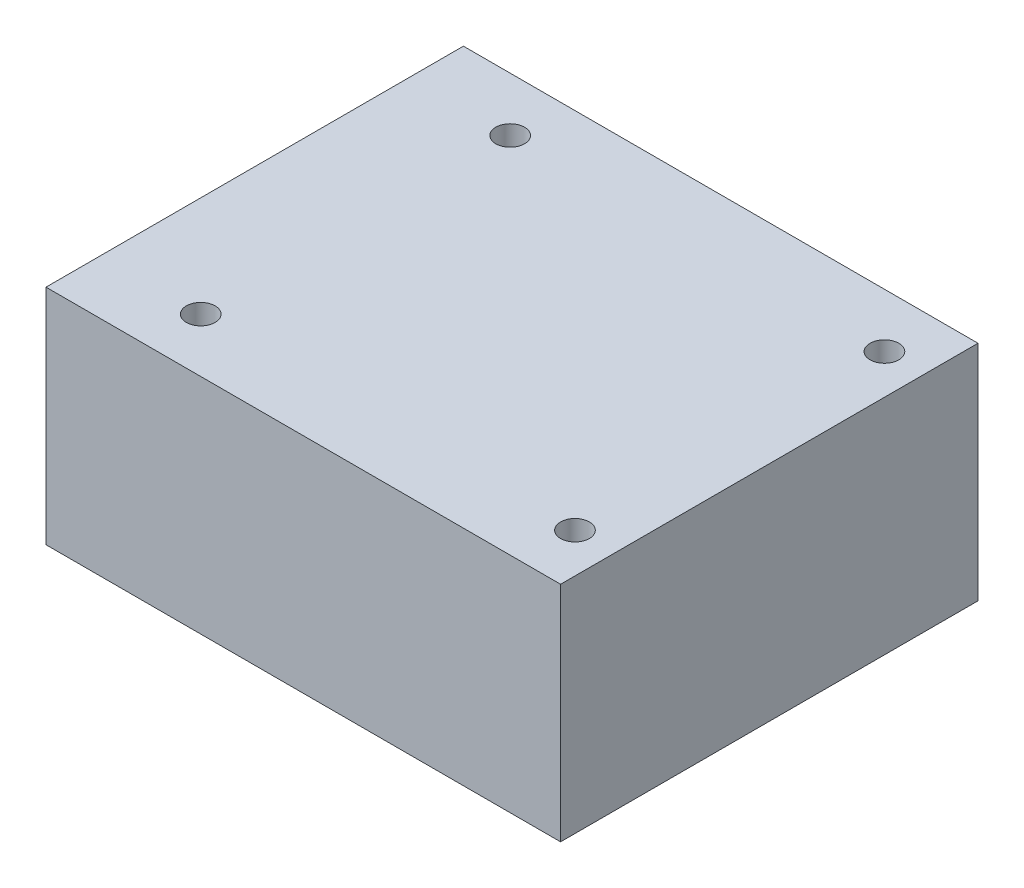
ISO-10303-21;
HEADER;
FILE_DESCRIPTION(('STEP AP214'),'2;1');
FILE_NAME('part.step','',(''),(''),'','','');
FILE_SCHEMA(('AUTOMOTIVE_DESIGN { 1 0 10303 214 1 1 1 1 }'));
ENDSEC;
DATA;
#1=APPLICATION_CONTEXT('core data for automotive mechanical design processes');
#2=APPLICATION_PROTOCOL_DEFINITION('international standard','automotive_design',2000,#1);
#3=PRODUCT_CONTEXT('',#1,'mechanical');
#4=PRODUCT('Part','Part','',(#3));
#5=PRODUCT_RELATED_PRODUCT_CATEGORY('part','',(#4));
#6=PRODUCT_DEFINITION_FORMATION('','',#4);
#7=PRODUCT_DEFINITION_CONTEXT('part definition',#1,'design');
#8=PRODUCT_DEFINITION('design','',#6,#7);
#9=PRODUCT_DEFINITION_SHAPE('','',#8);
#10=(LENGTH_UNIT() NAMED_UNIT(*) SI_UNIT(.MILLI.,.METRE.));
#11=(NAMED_UNIT(*) PLANE_ANGLE_UNIT() SI_UNIT($,.RADIAN.));
#12=(NAMED_UNIT(*) SI_UNIT($,.STERADIAN.) SOLID_ANGLE_UNIT());
#13=UNCERTAINTY_MEASURE_WITH_UNIT(LENGTH_MEASURE(1.E-05),#10,'distance_accuracy_value','');
#14=(GEOMETRIC_REPRESENTATION_CONTEXT(3) GLOBAL_UNCERTAINTY_ASSIGNED_CONTEXT((#13)) GLOBAL_UNIT_ASSIGNED_CONTEXT((#10,
#11,#12)) REPRESENTATION_CONTEXT('',''));
#15=CARTESIAN_POINT('',(0.,0.,0.));
#16=DIRECTION('',(0.,0.,1.));
#17=DIRECTION('',(1.,0.,0.));
#18=AXIS2_PLACEMENT_3D('',#15,#16,#17);
#19=CARTESIAN_POINT('',(35.75,31.,29.));
#20=DIRECTION('',(0.,1.,0.));
#21=DIRECTION('',(0.,0.,1.));
#22=AXIS2_PLACEMENT_3D('',#19,#20,#21);
#23=PLANE('',#22);
#24=CARTESIAN_POINT('',(30.25,31.,21.5));
#25=DIRECTION('',(0.,1.,0.));
#26=DIRECTION('',(0.,0.,1.));
#27=AXIS2_PLACEMENT_3D('',#24,#25,#26);
#28=CIRCLE('',#27,2.);
#29=CARTESIAN_POINT('',(30.25,31.,23.5));
#30=VERTEX_POINT('',#29);
#31=EDGE_CURVE('E119',#30,#30,#28,.T.);
#32=ORIENTED_EDGE('',*,*,#31,.F.);
#33=EDGE_LOOP('',(#32));
#34=FACE_BOUND('',#33,.T.);
#35=CARTESIAN_POINT('',(-21.75,31.,-21.5));
#36=DIRECTION('',(0.,1.,0.));
#37=DIRECTION('',(0.,0.,1.));
#38=AXIS2_PLACEMENT_3D('',#35,#36,#37);
#39=CIRCLE('',#38,2.);
#40=CARTESIAN_POINT('',(-21.75,31.,-19.5));
#41=VERTEX_POINT('',#40);
#42=EDGE_CURVE('E98',#41,#41,#39,.T.);
#43=ORIENTED_EDGE('',*,*,#42,.F.);
#44=EDGE_LOOP('',(#43));
#45=FACE_BOUND('',#44,.T.);
#46=DIRECTION('',(0.,0.,-1.));
#47=VECTOR('',#46,1.);
#48=CARTESIAN_POINT('',(35.75,31.,-29.));
#49=LINE('',#48,#47);
#50=CARTESIAN_POINT('',(35.75,31.,29.));
#51=VERTEX_POINT('',#50);
#52=CARTESIAN_POINT('',(35.75,31.,-29.));
#53=VERTEX_POINT('',#52);
#54=EDGE_CURVE('E83',#51,#53,#49,.T.);
#55=ORIENTED_EDGE('',*,*,#54,.T.);
#56=DIRECTION('',(-1.,0.,0.));
#57=VECTOR('',#56,1.);
#58=CARTESIAN_POINT('',(-35.75,31.,-29.));
#59=LINE('',#58,#57);
#60=CARTESIAN_POINT('',(-35.75,31.,-29.));
#61=VERTEX_POINT('',#60);
#62=EDGE_CURVE('E78',#53,#61,#59,.T.);
#63=ORIENTED_EDGE('',*,*,#62,.T.);
#64=DIRECTION('',(0.,0.,1.));
#65=VECTOR('',#64,1.);
#66=CARTESIAN_POINT('',(-35.75,31.,-29.));
#67=LINE('',#66,#65);
#68=CARTESIAN_POINT('',(-35.75,31.,29.));
#69=VERTEX_POINT('',#68);
#70=EDGE_CURVE('E81',#61,#69,#67,.T.);
#71=ORIENTED_EDGE('',*,*,#70,.T.);
#72=DIRECTION('',(1.,0.,0.));
#73=VECTOR('',#72,1.);
#74=CARTESIAN_POINT('',(-35.75,31.,29.));
#75=LINE('',#74,#73);
#76=EDGE_CURVE('E48',#69,#51,#75,.T.);
#77=ORIENTED_EDGE('',*,*,#76,.T.);
#78=EDGE_LOOP('',(#55,#63,#71,#77));
#79=FACE_BOUND('',#78,.T.);
#80=CARTESIAN_POINT('',(30.25,31.,-21.5));
#81=DIRECTION('',(0.,1.,0.));
#82=DIRECTION('',(0.,0.,1.));
#83=AXIS2_PLACEMENT_3D('',#80,#81,#82);
#84=CIRCLE('',#83,2.);
#85=CARTESIAN_POINT('',(30.25,31.,-19.5));
#86=VERTEX_POINT('',#85);
#87=EDGE_CURVE('E113',#86,#86,#84,.T.);
#88=ORIENTED_EDGE('',*,*,#87,.F.);
#89=EDGE_LOOP('',(#88));
#90=FACE_BOUND('',#89,.T.);
#91=CARTESIAN_POINT('',(-21.75,31.,21.5));
#92=DIRECTION('',(0.,1.,0.));
#93=DIRECTION('',(0.,0.,1.));
#94=AXIS2_PLACEMENT_3D('',#91,#92,#93);
#95=CIRCLE('',#94,2.);
#96=CARTESIAN_POINT('',(-21.75,31.,23.5));
#97=VERTEX_POINT('',#96);
#98=EDGE_CURVE('E125',#97,#97,#95,.T.);
#99=ORIENTED_EDGE('',*,*,#98,.F.);
#100=EDGE_LOOP('',(#99));
#101=FACE_BOUND('',#100,.T.);
#102=ADVANCED_FACE('F31',(#34,#45,#79,#90,#101),#23,.T.);
#103=CARTESIAN_POINT('',(35.75,0.,29.));
#104=DIRECTION('',(0.,1.,0.));
#105=DIRECTION('',(0.,0.,1.));
#106=AXIS2_PLACEMENT_3D('',#103,#104,#105);
#107=PLANE('',#106);
#108=CARTESIAN_POINT('',(30.25,0.,21.5));
#109=DIRECTION('',(0.,1.,0.));
#110=DIRECTION('',(0.,0.,1.));
#111=AXIS2_PLACEMENT_3D('',#108,#109,#110);
#112=CIRCLE('',#111,2.);
#113=CARTESIAN_POINT('',(30.25,0.,23.5));
#114=VERTEX_POINT('',#113);
#115=EDGE_CURVE('E122',#114,#114,#112,.T.);
#116=ORIENTED_EDGE('',*,*,#115,.T.);
#117=EDGE_LOOP('',(#116));
#118=FACE_BOUND('',#117,.T.);
#119=CARTESIAN_POINT('',(-21.75,0.,-21.5));
#120=DIRECTION('',(0.,1.,0.));
#121=DIRECTION('',(0.,0.,1.));
#122=AXIS2_PLACEMENT_3D('',#119,#120,#121);
#123=CIRCLE('',#122,2.);
#124=CARTESIAN_POINT('',(-21.75,0.,-19.5));
#125=VERTEX_POINT('',#124);
#126=EDGE_CURVE('E110',#125,#125,#123,.T.);
#127=ORIENTED_EDGE('',*,*,#126,.T.);
#128=EDGE_LOOP('',(#127));
#129=FACE_BOUND('',#128,.T.);
#130=DIRECTION('',(0.,0.,-1.));
#131=VECTOR('',#130,1.);
#132=CARTESIAN_POINT('',(35.75,0.,-29.));
#133=LINE('',#132,#131);
#134=CARTESIAN_POINT('',(35.75,0.,29.));
#135=VERTEX_POINT('',#134);
#136=CARTESIAN_POINT('',(35.75,0.,-29.));
#137=VERTEX_POINT('',#136);
#138=EDGE_CURVE('E95',#135,#137,#133,.T.);
#139=ORIENTED_EDGE('',*,*,#138,.F.);
#140=DIRECTION('',(1.,0.,0.));
#141=VECTOR('',#140,1.);
#142=CARTESIAN_POINT('',(-35.75,0.,29.));
#143=LINE('',#142,#141);
#144=CARTESIAN_POINT('',(-35.75,0.,29.));
#145=VERTEX_POINT('',#144);
#146=EDGE_CURVE('E71',#145,#135,#143,.T.);
#147=ORIENTED_EDGE('',*,*,#146,.F.);
#148=DIRECTION('',(0.,0.,1.));
#149=VECTOR('',#148,1.);
#150=CARTESIAN_POINT('',(-35.75,0.,-29.));
#151=LINE('',#150,#149);
#152=CARTESIAN_POINT('',(-35.75,0.,-29.));
#153=VERTEX_POINT('',#152);
#154=EDGE_CURVE('E65',#153,#145,#151,.T.);
#155=ORIENTED_EDGE('',*,*,#154,.F.);
#156=DIRECTION('',(-1.,0.,0.));
#157=VECTOR('',#156,1.);
#158=CARTESIAN_POINT('',(-35.75,0.,-29.));
#159=LINE('',#158,#157);
#160=EDGE_CURVE('E87',#137,#153,#159,.T.);
#161=ORIENTED_EDGE('',*,*,#160,.F.);
#162=EDGE_LOOP('',(#139,#147,#155,#161));
#163=FACE_BOUND('',#162,.T.);
#164=CARTESIAN_POINT('',(30.25,0.,-21.5));
#165=DIRECTION('',(0.,1.,0.));
#166=DIRECTION('',(0.,0.,1.));
#167=AXIS2_PLACEMENT_3D('',#164,#165,#166);
#168=CIRCLE('',#167,2.);
#169=CARTESIAN_POINT('',(30.25,0.,-19.5));
#170=VERTEX_POINT('',#169);
#171=EDGE_CURVE('E116',#170,#170,#168,.T.);
#172=ORIENTED_EDGE('',*,*,#171,.T.);
#173=EDGE_LOOP('',(#172));
#174=FACE_BOUND('',#173,.T.);
#175=CARTESIAN_POINT('',(-21.75,0.,21.5));
#176=DIRECTION('',(0.,1.,0.));
#177=DIRECTION('',(0.,0.,1.));
#178=AXIS2_PLACEMENT_3D('',#175,#176,#177);
#179=CIRCLE('',#178,2.);
#180=CARTESIAN_POINT('',(-21.75,0.,23.5));
#181=VERTEX_POINT('',#180);
#182=EDGE_CURVE('E128',#181,#181,#179,.T.);
#183=ORIENTED_EDGE('',*,*,#182,.T.);
#184=EDGE_LOOP('',(#183));
#185=FACE_BOUND('',#184,.T.);
#186=ADVANCED_FACE('F106',(#118,#129,#163,#174,#185),#107,.F.);
#187=CARTESIAN_POINT('',(35.75,31.,-29.));
#188=DIRECTION('',(-1.,0.,0.));
#189=DIRECTION('',(0.,0.,1.));
#190=AXIS2_PLACEMENT_3D('',#187,#188,#189);
#191=PLANE('',#190);
#192=ORIENTED_EDGE('',*,*,#138,.T.);
#193=DIRECTION('',(0.,-1.,0.));
#194=VECTOR('',#193,1.);
#195=CARTESIAN_POINT('',(35.75,31.,-29.));
#196=LINE('',#195,#194);
#197=EDGE_CURVE('E11',#53,#137,#196,.T.);
#198=ORIENTED_EDGE('',*,*,#197,.F.);
#199=ORIENTED_EDGE('',*,*,#54,.F.);
#200=DIRECTION('',(0.,-1.,0.));
#201=VECTOR('',#200,1.);
#202=CARTESIAN_POINT('',(35.75,31.,29.));
#203=LINE('',#202,#201);
#204=EDGE_CURVE('E91',#51,#135,#203,.T.);
#205=ORIENTED_EDGE('',*,*,#204,.T.);
#206=EDGE_LOOP('',(#192,#198,#199,#205));
#207=FACE_BOUND('',#206,.T.);
#208=ADVANCED_FACE('F33',(#207),#191,.F.);
#209=CARTESIAN_POINT('',(-35.75,31.,-29.));
#210=DIRECTION('',(0.,0.,1.));
#211=DIRECTION('',(1.,0.,0.));
#212=AXIS2_PLACEMENT_3D('',#209,#210,#211);
#213=PLANE('',#212);
#214=ORIENTED_EDGE('',*,*,#160,.T.);
#215=DIRECTION('',(0.,-1.,0.));
#216=VECTOR('',#215,1.);
#217=CARTESIAN_POINT('',(-35.75,31.,-29.));
#218=LINE('',#217,#216);
#219=EDGE_CURVE('E40',#61,#153,#218,.T.);
#220=ORIENTED_EDGE('',*,*,#219,.F.);
#221=ORIENTED_EDGE('',*,*,#62,.F.);
#222=ORIENTED_EDGE('',*,*,#197,.T.);
#223=EDGE_LOOP('',(#214,#220,#221,#222));
#224=FACE_BOUND('',#223,.T.);
#225=ADVANCED_FACE('F86',(#224),#213,.F.);
#226=CARTESIAN_POINT('',(-35.75,31.,-29.));
#227=DIRECTION('',(1.,0.,0.));
#228=DIRECTION('',(0.,0.,-1.));
#229=AXIS2_PLACEMENT_3D('',#226,#227,#228);
#230=PLANE('',#229);
#231=ORIENTED_EDGE('',*,*,#154,.T.);
#232=DIRECTION('',(0.,-1.,0.));
#233=VECTOR('',#232,1.);
#234=CARTESIAN_POINT('',(-35.75,31.,29.));
#235=LINE('',#234,#233);
#236=EDGE_CURVE('E88',#69,#145,#235,.T.);
#237=ORIENTED_EDGE('',*,*,#236,.F.);
#238=ORIENTED_EDGE('',*,*,#70,.F.);
#239=ORIENTED_EDGE('',*,*,#219,.T.);
#240=EDGE_LOOP('',(#231,#237,#238,#239));
#241=FACE_BOUND('',#240,.T.);
#242=ADVANCED_FACE('F89',(#241),#230,.F.);
#243=CARTESIAN_POINT('',(-35.75,31.,29.));
#244=DIRECTION('',(0.,0.,-1.));
#245=DIRECTION('',(-1.,0.,0.));
#246=AXIS2_PLACEMENT_3D('',#243,#244,#245);
#247=PLANE('',#246);
#248=ORIENTED_EDGE('',*,*,#146,.T.);
#249=ORIENTED_EDGE('',*,*,#204,.F.);
#250=ORIENTED_EDGE('',*,*,#76,.F.);
#251=ORIENTED_EDGE('',*,*,#236,.T.);
#252=EDGE_LOOP('',(#248,#249,#250,#251));
#253=FACE_BOUND('',#252,.T.);
#254=ADVANCED_FACE('F103',(#253),#247,.F.);
#255=CARTESIAN_POINT('',(-21.75,31.,-21.5));
#256=DIRECTION('',(0.,-1.,0.));
#257=DIRECTION('',(0.,0.,-1.));
#258=AXIS2_PLACEMENT_3D('',#255,#256,#257);
#259=CYLINDRICAL_SURFACE('',#258,2.);
#260=ORIENTED_EDGE('',*,*,#42,.T.);
#261=EDGE_LOOP('',(#260));
#262=FACE_BOUND('',#261,.T.);
#263=ORIENTED_EDGE('',*,*,#126,.F.);
#264=EDGE_LOOP('',(#263));
#265=FACE_BOUND('',#264,.T.);
#266=ADVANCED_FACE('F148',(#262,#265),#259,.F.);
#267=CARTESIAN_POINT('',(30.25,31.,-21.5));
#268=DIRECTION('',(0.,-1.,0.));
#269=DIRECTION('',(0.,0.,-1.));
#270=AXIS2_PLACEMENT_3D('',#267,#268,#269);
#271=CYLINDRICAL_SURFACE('',#270,2.);
#272=ORIENTED_EDGE('',*,*,#87,.T.);
#273=EDGE_LOOP('',(#272));
#274=FACE_BOUND('',#273,.T.);
#275=ORIENTED_EDGE('',*,*,#171,.F.);
#276=EDGE_LOOP('',(#275));
#277=FACE_BOUND('',#276,.T.);
#278=ADVANCED_FACE('F194',(#274,#277),#271,.F.);
#279=CARTESIAN_POINT('',(30.25,31.,21.5));
#280=DIRECTION('',(0.,-1.,0.));
#281=DIRECTION('',(0.,0.,-1.));
#282=AXIS2_PLACEMENT_3D('',#279,#280,#281);
#283=CYLINDRICAL_SURFACE('',#282,2.);
#284=ORIENTED_EDGE('',*,*,#31,.T.);
#285=EDGE_LOOP('',(#284));
#286=FACE_BOUND('',#285,.T.);
#287=ORIENTED_EDGE('',*,*,#115,.F.);
#288=EDGE_LOOP('',(#287));
#289=FACE_BOUND('',#288,.T.);
#290=ADVANCED_FACE('F202',(#286,#289),#283,.F.);
#291=CARTESIAN_POINT('',(-21.75,31.,21.5));
#292=DIRECTION('',(0.,-1.,0.));
#293=DIRECTION('',(0.,0.,-1.));
#294=AXIS2_PLACEMENT_3D('',#291,#292,#293);
#295=CYLINDRICAL_SURFACE('',#294,2.);
#296=ORIENTED_EDGE('',*,*,#98,.T.);
#297=EDGE_LOOP('',(#296));
#298=FACE_BOUND('',#297,.T.);
#299=ORIENTED_EDGE('',*,*,#182,.F.);
#300=EDGE_LOOP('',(#299));
#301=FACE_BOUND('',#300,.T.);
#302=ADVANCED_FACE('F134',(#298,#301),#295,.F.);
#303=CLOSED_SHELL('',(#102,#186,#208,#225,#242,#254,#266,#278,#290,#302));
#304=MANIFOLD_SOLID_BREP('B2',#303);
#305=ADVANCED_BREP_SHAPE_REPRESENTATION('',(#18,#304),#14);
#306=SHAPE_DEFINITION_REPRESENTATION(#9,#305);
ENDSEC;
END-ISO-10303-21;
